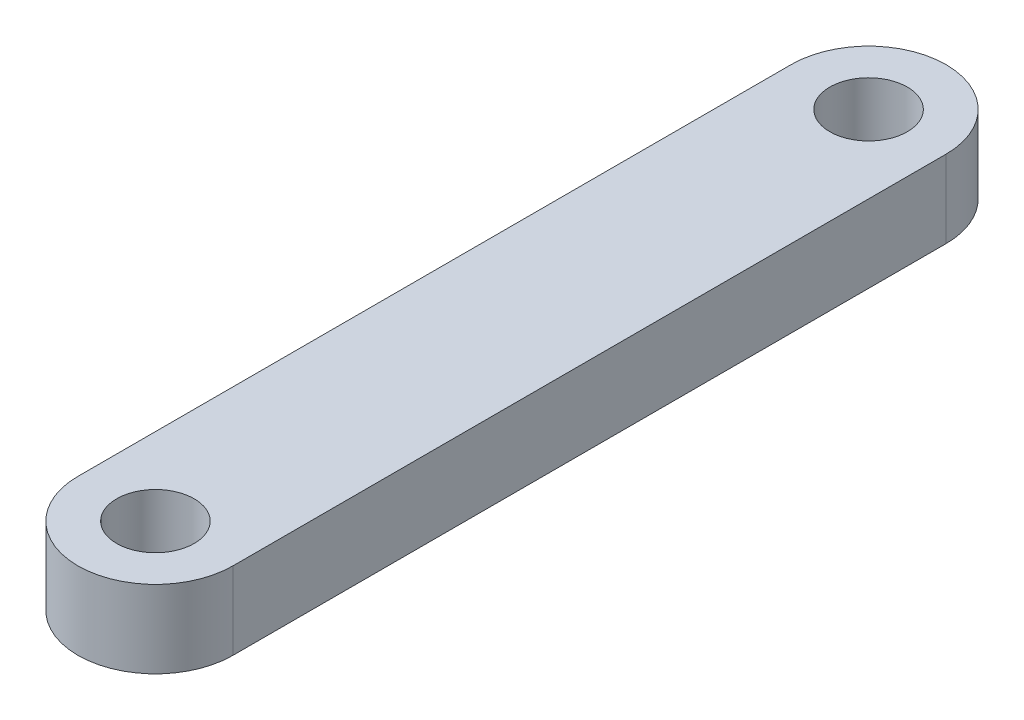
ISO-10303-21;
HEADER;
FILE_DESCRIPTION(('STEP AP214'),'2;1');
FILE_NAME('part.step','',(''),(''),'','','');
FILE_SCHEMA(('AUTOMOTIVE_DESIGN { 1 0 10303 214 1 1 1 1 }'));
ENDSEC;
DATA;
#1=APPLICATION_CONTEXT('core data for automotive mechanical design processes');
#2=APPLICATION_PROTOCOL_DEFINITION('international standard','automotive_design',2000,#1);
#3=PRODUCT_CONTEXT('',#1,'mechanical');
#4=PRODUCT('Part','Part','',(#3));
#5=PRODUCT_RELATED_PRODUCT_CATEGORY('part','',(#4));
#6=PRODUCT_DEFINITION_FORMATION('','',#4);
#7=PRODUCT_DEFINITION_CONTEXT('part definition',#1,'design');
#8=PRODUCT_DEFINITION('design','',#6,#7);
#9=PRODUCT_DEFINITION_SHAPE('','',#8);
#10=(LENGTH_UNIT() NAMED_UNIT(*) SI_UNIT(.MILLI.,.METRE.));
#11=(NAMED_UNIT(*) PLANE_ANGLE_UNIT() SI_UNIT($,.RADIAN.));
#12=(NAMED_UNIT(*) SI_UNIT($,.STERADIAN.) SOLID_ANGLE_UNIT());
#13=UNCERTAINTY_MEASURE_WITH_UNIT(LENGTH_MEASURE(1.E-05),#10,'distance_accuracy_value','');
#14=(GEOMETRIC_REPRESENTATION_CONTEXT(3) GLOBAL_UNCERTAINTY_ASSIGNED_CONTEXT((#13)) GLOBAL_UNIT_ASSIGNED_CONTEXT((#10,
#11,#12)) REPRESENTATION_CONTEXT('',''));
#15=CARTESIAN_POINT('',(0.,0.,0.));
#16=DIRECTION('',(0.,0.,1.));
#17=DIRECTION('',(1.,0.,0.));
#18=AXIS2_PLACEMENT_3D('',#15,#16,#17);
#19=CARTESIAN_POINT('',(0.,3.175,29.21));
#20=DIRECTION('',(0.,1.,0.));
#21=DIRECTION('',(0.,0.,1.));
#22=AXIS2_PLACEMENT_3D('',#19,#20,#21);
#23=PLANE('',#22);
#24=CARTESIAN_POINT('',(0.,3.175,-29.21));
#25=DIRECTION('',(0.,1.,0.));
#26=DIRECTION('',(0.,0.,1.));
#27=AXIS2_PLACEMENT_3D('',#24,#25,#26);
#28=CIRCLE('',#27,3.175);
#29=CARTESIAN_POINT('',(0.,3.175,-26.035));
#30=VERTEX_POINT('',#29);
#31=EDGE_CURVE('E118',#30,#30,#28,.T.);
#32=ORIENTED_EDGE('',*,*,#31,.F.);
#33=EDGE_LOOP('',(#32));
#34=FACE_BOUND('',#33,.T.);
#35=CARTESIAN_POINT('',(0.,3.175,29.21));
#36=DIRECTION('',(0.,1.,0.));
#37=DIRECTION('',(0.,0.,1.));
#38=AXIS2_PLACEMENT_3D('',#35,#36,#37);
#39=CIRCLE('',#38,6.35000000000001);
#40=CARTESIAN_POINT('',(-6.35000000000001,3.175,29.21));
#41=VERTEX_POINT('',#40);
#42=CARTESIAN_POINT('',(6.35000000000001,3.175,29.21));
#43=VERTEX_POINT('',#42);
#44=EDGE_CURVE('E98',#41,#43,#39,.T.);
#45=ORIENTED_EDGE('',*,*,#44,.T.);
#46=DIRECTION('',(0.,0.,-1.));
#47=VECTOR('',#46,1.);
#48=CARTESIAN_POINT('',(6.35000000000001,3.175,29.21));
#49=LINE('',#48,#47);
#50=CARTESIAN_POINT('',(6.35,3.175,-29.21));
#51=VERTEX_POINT('',#50);
#52=EDGE_CURVE('E93',#43,#51,#49,.T.);
#53=ORIENTED_EDGE('',*,*,#52,.T.);
#54=CARTESIAN_POINT('',(0.,3.175,-29.21));
#55=DIRECTION('',(0.,1.,0.));
#56=DIRECTION('',(0.,0.,1.));
#57=AXIS2_PLACEMENT_3D('',#54,#55,#56);
#58=CIRCLE('',#57,6.35000000000001);
#59=CARTESIAN_POINT('',(-6.35000000000002,3.175,-29.21));
#60=VERTEX_POINT('',#59);
#61=EDGE_CURVE('E96',#51,#60,#58,.T.);
#62=ORIENTED_EDGE('',*,*,#61,.T.);
#63=DIRECTION('',(0.,0.,1.));
#64=VECTOR('',#63,1.);
#65=CARTESIAN_POINT('',(-6.35000000000001,3.175,29.21));
#66=LINE('',#65,#64);
#67=EDGE_CURVE('E63',#60,#41,#66,.T.);
#68=ORIENTED_EDGE('',*,*,#67,.T.);
#69=EDGE_LOOP('',(#45,#53,#62,#68));
#70=FACE_BOUND('',#69,.T.);
#71=CARTESIAN_POINT('',(0.,3.175,29.21));
#72=DIRECTION('',(0.,1.,0.));
#73=DIRECTION('',(0.,0.,1.));
#74=AXIS2_PLACEMENT_3D('',#71,#72,#73);
#75=CIRCLE('',#74,3.175);
#76=CARTESIAN_POINT('',(0.,3.175,32.385));
#77=VERTEX_POINT('',#76);
#78=EDGE_CURVE('E140',#77,#77,#75,.T.);
#79=ORIENTED_EDGE('',*,*,#78,.F.);
#80=EDGE_LOOP('',(#79));
#81=FACE_BOUND('',#80,.T.);
#82=ADVANCED_FACE('F45',(#34,#70,#81),#23,.T.);
#83=CARTESIAN_POINT('',(0.,-3.175,29.21));
#84=DIRECTION('',(0.,1.,0.));
#85=DIRECTION('',(0.,0.,1.));
#86=AXIS2_PLACEMENT_3D('',#83,#84,#85);
#87=PLANE('',#86);
#88=CARTESIAN_POINT('',(0.,-3.175,29.21));
#89=DIRECTION('',(0.,1.,0.));
#90=DIRECTION('',(0.,0.,1.));
#91=AXIS2_PLACEMENT_3D('',#88,#89,#90);
#92=CIRCLE('',#91,6.35000000000001);
#93=CARTESIAN_POINT('',(-6.35000000000001,-3.175,29.21));
#94=VERTEX_POINT('',#93);
#95=CARTESIAN_POINT('',(6.35000000000001,-3.175,29.21));
#96=VERTEX_POINT('',#95);
#97=EDGE_CURVE('E114',#94,#96,#92,.T.);
#98=ORIENTED_EDGE('',*,*,#97,.F.);
#99=DIRECTION('',(0.,0.,1.));
#100=VECTOR('',#99,1.);
#101=CARTESIAN_POINT('',(-6.35000000000001,-3.175,29.21));
#102=LINE('',#101,#100);
#103=CARTESIAN_POINT('',(-6.35000000000002,-3.175,-29.21));
#104=VERTEX_POINT('',#103);
#105=EDGE_CURVE('E86',#104,#94,#102,.T.);
#106=ORIENTED_EDGE('',*,*,#105,.F.);
#107=CARTESIAN_POINT('',(0.,-3.175,-29.21));
#108=DIRECTION('',(0.,1.,0.));
#109=DIRECTION('',(0.,0.,1.));
#110=AXIS2_PLACEMENT_3D('',#107,#108,#109);
#111=CIRCLE('',#110,6.35000000000001);
#112=CARTESIAN_POINT('',(6.35,-3.175,-29.21));
#113=VERTEX_POINT('',#112);
#114=EDGE_CURVE('E80',#113,#104,#111,.T.);
#115=ORIENTED_EDGE('',*,*,#114,.F.);
#116=DIRECTION('',(0.,0.,-1.));
#117=VECTOR('',#116,1.);
#118=CARTESIAN_POINT('',(6.35000000000001,-3.175,29.21));
#119=LINE('',#118,#117);
#120=EDGE_CURVE('E103',#96,#113,#119,.T.);
#121=ORIENTED_EDGE('',*,*,#120,.F.);
#122=EDGE_LOOP('',(#98,#106,#115,#121));
#123=FACE_BOUND('',#122,.T.);
#124=CARTESIAN_POINT('',(0.,-3.175,-29.21));
#125=DIRECTION('',(0.,1.,0.));
#126=DIRECTION('',(0.,0.,1.));
#127=AXIS2_PLACEMENT_3D('',#124,#125,#126);
#128=CIRCLE('',#127,3.175);
#129=CARTESIAN_POINT('',(0.,-3.175,-26.035));
#130=VERTEX_POINT('',#129);
#131=EDGE_CURVE('E136',#130,#130,#128,.T.);
#132=ORIENTED_EDGE('',*,*,#131,.T.);
#133=EDGE_LOOP('',(#132));
#134=FACE_BOUND('',#133,.T.);
#135=CARTESIAN_POINT('',(0.,-3.175,29.21));
#136=DIRECTION('',(0.,1.,0.));
#137=DIRECTION('',(0.,0.,1.));
#138=AXIS2_PLACEMENT_3D('',#135,#136,#137);
#139=CIRCLE('',#138,3.175);
#140=CARTESIAN_POINT('',(0.,-3.175,32.385));
#141=VERTEX_POINT('',#140);
#142=EDGE_CURVE('E144',#141,#141,#139,.T.);
#143=ORIENTED_EDGE('',*,*,#142,.T.);
#144=EDGE_LOOP('',(#143));
#145=FACE_BOUND('',#144,.T.);
#146=ADVANCED_FACE('F131',(#123,#134,#145),#87,.F.);
#147=CARTESIAN_POINT('',(0.,3.175,29.21));
#148=DIRECTION('',(0.,-1.,0.));
#149=DIRECTION('',(0.,0.,-1.));
#150=AXIS2_PLACEMENT_3D('',#147,#148,#149);
#151=CYLINDRICAL_SURFACE('',#150,6.35000000000001);
#152=ORIENTED_EDGE('',*,*,#97,.T.);
#153=DIRECTION('',(0.,-1.,0.));
#154=VECTOR('',#153,1.);
#155=CARTESIAN_POINT('',(6.35000000000001,3.175,29.21));
#156=LINE('',#155,#154);
#157=EDGE_CURVE('E11',#43,#96,#156,.T.);
#158=ORIENTED_EDGE('',*,*,#157,.F.);
#159=ORIENTED_EDGE('',*,*,#44,.F.);
#160=DIRECTION('',(0.,-1.,0.));
#161=VECTOR('',#160,1.);
#162=CARTESIAN_POINT('',(-6.35000000000001,3.175,29.21));
#163=LINE('',#162,#161);
#164=EDGE_CURVE('E110',#41,#94,#163,.T.);
#165=ORIENTED_EDGE('',*,*,#164,.T.);
#166=EDGE_LOOP('',(#152,#158,#159,#165));
#167=FACE_BOUND('',#166,.T.);
#168=ADVANCED_FACE('F47',(#167),#151,.T.);
#169=CARTESIAN_POINT('',(6.35000000000001,3.175,29.21));
#170=DIRECTION('',(-1.,0.,0.));
#171=DIRECTION('',(0.,0.,1.));
#172=AXIS2_PLACEMENT_3D('',#169,#170,#171);
#173=PLANE('',#172);
#174=ORIENTED_EDGE('',*,*,#120,.T.);
#175=DIRECTION('',(0.,-1.,0.));
#176=VECTOR('',#175,1.);
#177=CARTESIAN_POINT('',(6.35,3.175,-29.21));
#178=LINE('',#177,#176);
#179=EDGE_CURVE('E55',#51,#113,#178,.T.);
#180=ORIENTED_EDGE('',*,*,#179,.F.);
#181=ORIENTED_EDGE('',*,*,#52,.F.);
#182=ORIENTED_EDGE('',*,*,#157,.T.);
#183=EDGE_LOOP('',(#174,#180,#181,#182));
#184=FACE_BOUND('',#183,.T.);
#185=ADVANCED_FACE('F102',(#184),#173,.F.);
#186=CARTESIAN_POINT('',(0.,3.175,-29.21));
#187=DIRECTION('',(0.,-1.,0.));
#188=DIRECTION('',(0.,0.,-1.));
#189=AXIS2_PLACEMENT_3D('',#186,#187,#188);
#190=CYLINDRICAL_SURFACE('',#189,6.35000000000001);
#191=ORIENTED_EDGE('',*,*,#114,.T.);
#192=DIRECTION('',(0.,-1.,0.));
#193=VECTOR('',#192,1.);
#194=CARTESIAN_POINT('',(-6.35000000000002,3.175,-29.21));
#195=LINE('',#194,#193);
#196=EDGE_CURVE('E105',#60,#104,#195,.T.);
#197=ORIENTED_EDGE('',*,*,#196,.F.);
#198=ORIENTED_EDGE('',*,*,#61,.F.);
#199=ORIENTED_EDGE('',*,*,#179,.T.);
#200=EDGE_LOOP('',(#191,#197,#198,#199));
#201=FACE_BOUND('',#200,.T.);
#202=ADVANCED_FACE('F106',(#201),#190,.T.);
#203=CARTESIAN_POINT('',(-6.35000000000001,3.175,29.21));
#204=DIRECTION('',(1.,0.,0.));
#205=DIRECTION('',(0.,0.,-1.));
#206=AXIS2_PLACEMENT_3D('',#203,#204,#205);
#207=PLANE('',#206);
#208=ORIENTED_EDGE('',*,*,#105,.T.);
#209=ORIENTED_EDGE('',*,*,#164,.F.);
#210=ORIENTED_EDGE('',*,*,#67,.F.);
#211=ORIENTED_EDGE('',*,*,#196,.T.);
#212=EDGE_LOOP('',(#208,#209,#210,#211));
#213=FACE_BOUND('',#212,.T.);
#214=ADVANCED_FACE('F128',(#213),#207,.F.);
#215=CARTESIAN_POINT('',(0.,3.175,-29.21));
#216=DIRECTION('',(0.,-1.,0.));
#217=DIRECTION('',(0.,0.,-1.));
#218=AXIS2_PLACEMENT_3D('',#215,#216,#217);
#219=CYLINDRICAL_SURFACE('',#218,3.175);
#220=ORIENTED_EDGE('',*,*,#31,.T.);
#221=EDGE_LOOP('',(#220));
#222=FACE_BOUND('',#221,.T.);
#223=ORIENTED_EDGE('',*,*,#131,.F.);
#224=EDGE_LOOP('',(#223));
#225=FACE_BOUND('',#224,.T.);
#226=ADVANCED_FACE('F163',(#222,#225),#219,.F.);
#227=CARTESIAN_POINT('',(0.,3.175,29.21));
#228=DIRECTION('',(0.,-1.,0.));
#229=DIRECTION('',(0.,0.,-1.));
#230=AXIS2_PLACEMENT_3D('',#227,#228,#229);
#231=CYLINDRICAL_SURFACE('',#230,3.175);
#232=ORIENTED_EDGE('',*,*,#78,.T.);
#233=EDGE_LOOP('',(#232));
#234=FACE_BOUND('',#233,.T.);
#235=ORIENTED_EDGE('',*,*,#142,.F.);
#236=EDGE_LOOP('',(#235));
#237=FACE_BOUND('',#236,.T.);
#238=ADVANCED_FACE('F152',(#234,#237),#231,.F.);
#239=CLOSED_SHELL('',(#82,#146,#168,#185,#202,#214,#226,#238));
#240=MANIFOLD_SOLID_BREP('B2',#239);
#241=ADVANCED_BREP_SHAPE_REPRESENTATION('',(#18,#240),#14);
#242=SHAPE_DEFINITION_REPRESENTATION(#9,#241);
ENDSEC;
END-ISO-10303-21;
